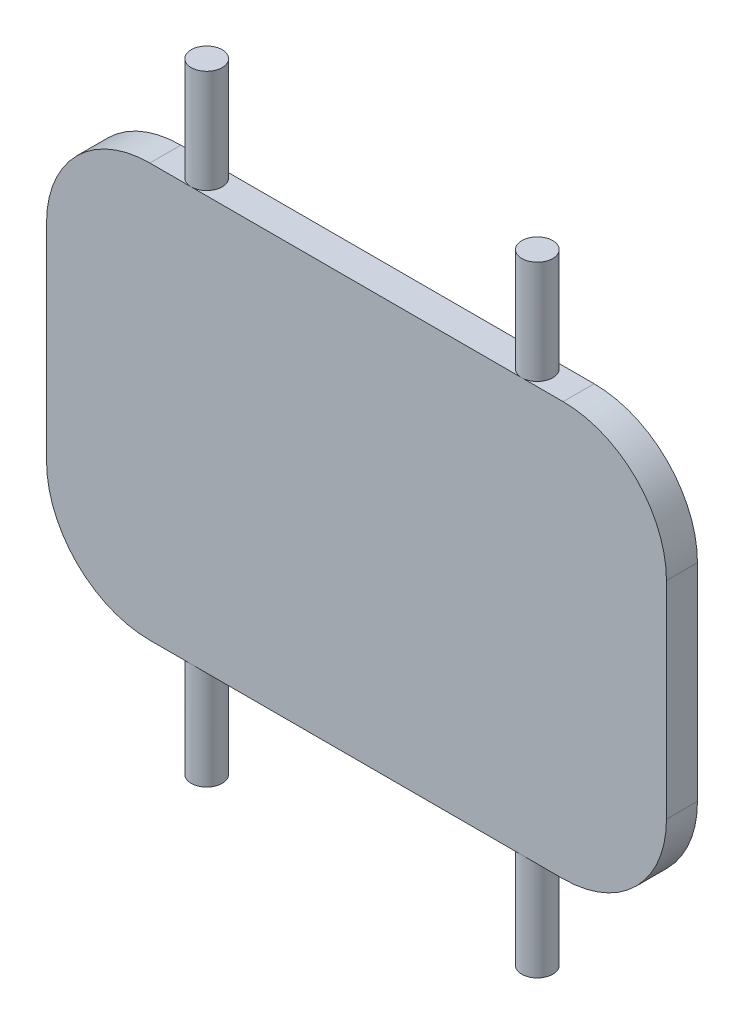
ISO-10303-21;
HEADER;
FILE_DESCRIPTION(('STEP AP214'),'2;1');
FILE_NAME('part.step','',(''),(''),'','','');
FILE_SCHEMA(('AUTOMOTIVE_DESIGN { 1 0 10303 214 1 1 1 1 }'));
ENDSEC;
DATA;
#1=APPLICATION_CONTEXT('core data for automotive mechanical design processes');
#2=APPLICATION_PROTOCOL_DEFINITION('international standard','automotive_design',2000,#1);
#3=PRODUCT_CONTEXT('',#1,'mechanical');
#4=PRODUCT('Part','Part','',(#3));
#5=PRODUCT_RELATED_PRODUCT_CATEGORY('part','',(#4));
#6=PRODUCT_DEFINITION_FORMATION('','',#4);
#7=PRODUCT_DEFINITION_CONTEXT('part definition',#1,'design');
#8=PRODUCT_DEFINITION('design','',#6,#7);
#9=PRODUCT_DEFINITION_SHAPE('','',#8);
#10=(LENGTH_UNIT() NAMED_UNIT(*) SI_UNIT(.MILLI.,.METRE.));
#11=(NAMED_UNIT(*) PLANE_ANGLE_UNIT() SI_UNIT($,.RADIAN.));
#12=(NAMED_UNIT(*) SI_UNIT($,.STERADIAN.) SOLID_ANGLE_UNIT());
#13=UNCERTAINTY_MEASURE_WITH_UNIT(LENGTH_MEASURE(1.E-05),#10,'distance_accuracy_value','');
#14=(GEOMETRIC_REPRESENTATION_CONTEXT(3) GLOBAL_UNCERTAINTY_ASSIGNED_CONTEXT((#13)) GLOBAL_UNIT_ASSIGNED_CONTEXT((#10,
#11,#12)) REPRESENTATION_CONTEXT('',''));
#15=CARTESIAN_POINT('',(0.,0.,0.));
#16=DIRECTION('',(0.,0.,1.));
#17=DIRECTION('',(1.,0.,0.));
#18=AXIS2_PLACEMENT_3D('',#15,#16,#17);
#19=CARTESIAN_POINT('',(-150.,100.,15.));
#20=DIRECTION('',(0.,-1.,0.));
#21=DIRECTION('',(0.,0.,-1.));
#22=AXIS2_PLACEMENT_3D('',#19,#20,#21);
#23=PLANE('',#22);
#24=DIRECTION('',(-1.,0.,0.));
#25=VECTOR('',#24,1.);
#26=CARTESIAN_POINT('',(-150.,100.,0.));
#27=LINE('',#26,#25);
#28=CARTESIAN_POINT('',(100.,100.,0.));
#29=VERTEX_POINT('',#28);
#30=CARTESIAN_POINT('',(80.,100.,0.));
#31=VERTEX_POINT('',#30);
#32=EDGE_CURVE('E140',#29,#31,#27,.T.);
#33=ORIENTED_EDGE('',*,*,#32,.T.);
#34=CARTESIAN_POINT('',(80.,100.,7.5));
#35=DIRECTION('',(0.,-1.,0.));
#36=DIRECTION('',(0.,0.,-1.));
#37=AXIS2_PLACEMENT_3D('',#34,#35,#36);
#38=CIRCLE('',#37,7.5);
#39=CARTESIAN_POINT('',(80.,100.,15.));
#40=VERTEX_POINT('',#39);
#41=EDGE_CURVE('E54',#31,#40,#38,.T.);
#42=ORIENTED_EDGE('',*,*,#41,.T.);
#43=DIRECTION('',(-1.,0.,0.));
#44=VECTOR('',#43,1.);
#45=CARTESIAN_POINT('',(-150.,100.,15.));
#46=LINE('',#45,#44);
#47=CARTESIAN_POINT('',(100.,100.,15.));
#48=VERTEX_POINT('',#47);
#49=EDGE_CURVE('E137',#48,#40,#46,.T.);
#50=ORIENTED_EDGE('',*,*,#49,.F.);
#51=DIRECTION('',(0.,0.,-1.));
#52=VECTOR('',#51,1.);
#53=CARTESIAN_POINT('',(100.,100.,15.));
#54=LINE('',#53,#52);
#55=EDGE_CURVE('E219',#48,#29,#54,.T.);
#56=ORIENTED_EDGE('',*,*,#55,.T.);
#57=EDGE_LOOP('',(#33,#42,#50,#56));
#58=FACE_BOUND('',#57,.T.);
#59=ADVANCED_FACE('F39',(#58),#23,.F.);
#60=CARTESIAN_POINT('',(-80.,100.,7.5));
#61=DIRECTION('',(0.,1.,0.));
#62=DIRECTION('',(0.,0.,-1.));
#63=AXIS2_PLACEMENT_3D('',#60,#61,#62);
#64=CIRCLE('',#63,7.5);
#65=CARTESIAN_POINT('',(-80.,100.,0.));
#66=VERTEX_POINT('',#65);
#67=CARTESIAN_POINT('',(-80.,100.,15.));
#68=VERTEX_POINT('',#67);
#69=EDGE_CURVE('E192',#66,#68,#64,.T.);
#70=ORIENTED_EDGE('',*,*,#69,.F.);
#71=CARTESIAN_POINT('',(-100.,100.,0.));
#72=VERTEX_POINT('',#71);
#73=EDGE_CURVE('E211',#66,#72,#27,.T.);
#74=ORIENTED_EDGE('',*,*,#73,.T.);
#75=DIRECTION('',(0.,0.,-1.));
#76=VECTOR('',#75,1.);
#77=CARTESIAN_POINT('',(-100.,100.,15.));
#78=LINE('',#77,#76);
#79=CARTESIAN_POINT('',(-100.,100.,15.));
#80=VERTEX_POINT('',#79);
#81=EDGE_CURVE('E214',#72,#80,#78,.F.);
#82=ORIENTED_EDGE('',*,*,#81,.T.);
#83=EDGE_CURVE('E148',#68,#80,#46,.T.);
#84=ORIENTED_EDGE('',*,*,#83,.F.);
#85=EDGE_LOOP('',(#70,#74,#82,#84));
#86=FACE_BOUND('',#85,.T.);
#87=ADVANCED_FACE('F209',(#86),#23,.F.);
#88=CARTESIAN_POINT('',(-150.,-100.,15.));
#89=DIRECTION('',(0.,1.,0.));
#90=DIRECTION('',(0.,0.,1.));
#91=AXIS2_PLACEMENT_3D('',#88,#89,#90);
#92=PLANE('',#91);
#93=DIRECTION('',(1.,0.,0.));
#94=VECTOR('',#93,1.);
#95=CARTESIAN_POINT('',(-150.,-100.,15.));
#96=LINE('',#95,#94);
#97=CARTESIAN_POINT('',(-80.,-100.,15.));
#98=VERTEX_POINT('',#97);
#99=CARTESIAN_POINT('',(80.,-100.,15.));
#100=VERTEX_POINT('',#99);
#101=EDGE_CURVE('E504',#98,#100,#96,.T.);
#102=ORIENTED_EDGE('',*,*,#101,.F.);
#103=CARTESIAN_POINT('',(-80.,-100.,7.5));
#104=DIRECTION('',(0.,1.,0.));
#105=DIRECTION('',(0.,0.,-1.));
#106=AXIS2_PLACEMENT_3D('',#103,#104,#105);
#107=CIRCLE('',#106,7.5);
#108=CARTESIAN_POINT('',(-80.,-100.,0.));
#109=VERTEX_POINT('',#108);
#110=EDGE_CURVE('E188',#98,#109,#107,.T.);
#111=ORIENTED_EDGE('',*,*,#110,.T.);
#112=DIRECTION('',(1.,0.,0.));
#113=VECTOR('',#112,1.);
#114=CARTESIAN_POINT('',(-150.,-100.,0.));
#115=LINE('',#114,#113);
#116=CARTESIAN_POINT('',(80.,-100.,0.));
#117=VERTEX_POINT('',#116);
#118=EDGE_CURVE('E169',#109,#117,#115,.T.);
#119=ORIENTED_EDGE('',*,*,#118,.T.);
#120=CARTESIAN_POINT('',(80.,-100.,7.5));
#121=DIRECTION('',(0.,-1.,0.));
#122=DIRECTION('',(0.,0.,-1.));
#123=AXIS2_PLACEMENT_3D('',#120,#121,#122);
#124=CIRCLE('',#123,7.5);
#125=EDGE_CURVE('E178',#100,#117,#124,.T.);
#126=ORIENTED_EDGE('',*,*,#125,.F.);
#127=EDGE_LOOP('',(#102,#111,#119,#126));
#128=FACE_BOUND('',#127,.T.);
#129=ADVANCED_FACE('F327',(#128),#92,.F.);
#130=CARTESIAN_POINT('',(-100.,-100.,0.));
#131=VERTEX_POINT('',#130);
#132=EDGE_CURVE('E165',#131,#109,#115,.T.);
#133=ORIENTED_EDGE('',*,*,#132,.T.);
#134=EDGE_CURVE('E183',#109,#98,#107,.T.);
#135=ORIENTED_EDGE('',*,*,#134,.T.);
#136=CARTESIAN_POINT('',(-100.,-100.,15.));
#137=VERTEX_POINT('',#136);
#138=EDGE_CURVE('E248',#137,#98,#96,.T.);
#139=ORIENTED_EDGE('',*,*,#138,.F.);
#140=DIRECTION('',(0.,0.,-1.));
#141=VECTOR('',#140,1.);
#142=CARTESIAN_POINT('',(-100.,-100.,15.));
#143=LINE('',#142,#141);
#144=EDGE_CURVE('E48',#137,#131,#143,.T.);
#145=ORIENTED_EDGE('',*,*,#144,.T.);
#146=EDGE_LOOP('',(#133,#135,#139,#145));
#147=FACE_BOUND('',#146,.T.);
#148=ADVANCED_FACE('F246',(#147),#92,.F.);
#149=CARTESIAN_POINT('',(150.,100.,15.));
#150=DIRECTION('',(-1.,0.,0.));
#151=DIRECTION('',(0.,0.,1.));
#152=AXIS2_PLACEMENT_3D('',#149,#150,#151);
#153=PLANE('',#152);
#154=DIRECTION('',(0.,1.,0.));
#155=VECTOR('',#154,1.);
#156=CARTESIAN_POINT('',(150.,100.,0.));
#157=LINE('',#156,#155);
#158=CARTESIAN_POINT('',(150.,-50.,0.));
#159=VERTEX_POINT('',#158);
#160=CARTESIAN_POINT('',(150.,50.,0.));
#161=VERTEX_POINT('',#160);
#162=EDGE_CURVE('E182',#159,#161,#157,.T.);
#163=ORIENTED_EDGE('',*,*,#162,.T.);
#164=DIRECTION('',(0.,0.,-1.));
#165=VECTOR('',#164,1.);
#166=CARTESIAN_POINT('',(150.,50.,15.));
#167=LINE('',#166,#165);
#168=CARTESIAN_POINT('',(150.,50.,15.));
#169=VERTEX_POINT('',#168);
#170=EDGE_CURVE('E233',#161,#169,#167,.F.);
#171=ORIENTED_EDGE('',*,*,#170,.T.);
#172=DIRECTION('',(0.,1.,0.));
#173=VECTOR('',#172,1.);
#174=CARTESIAN_POINT('',(150.,100.,15.));
#175=LINE('',#174,#173);
#176=CARTESIAN_POINT('',(150.,-50.,15.));
#177=VERTEX_POINT('',#176);
#178=EDGE_CURVE('E162',#177,#169,#175,.T.);
#179=ORIENTED_EDGE('',*,*,#178,.F.);
#180=DIRECTION('',(0.,0.,-1.));
#181=VECTOR('',#180,1.);
#182=CARTESIAN_POINT('',(150.,-50.,15.));
#183=LINE('',#182,#181);
#184=EDGE_CURVE('E228',#177,#159,#183,.T.);
#185=ORIENTED_EDGE('',*,*,#184,.T.);
#186=EDGE_LOOP('',(#163,#171,#179,#185));
#187=FACE_BOUND('',#186,.T.);
#188=ADVANCED_FACE('F297',(#187),#153,.F.);
#189=EDGE_CURVE('E62',#40,#68,#46,.T.);
#190=ORIENTED_EDGE('',*,*,#189,.F.);
#191=EDGE_CURVE('E127',#40,#31,#38,.T.);
#192=ORIENTED_EDGE('',*,*,#191,.T.);
#193=EDGE_CURVE('E304',#31,#66,#27,.T.);
#194=ORIENTED_EDGE('',*,*,#193,.T.);
#195=EDGE_CURVE('E145',#68,#66,#64,.T.);
#196=ORIENTED_EDGE('',*,*,#195,.F.);
#197=EDGE_LOOP('',(#190,#192,#194,#196));
#198=FACE_BOUND('',#197,.T.);
#199=ADVANCED_FACE('F143',(#198),#23,.F.);
#200=CARTESIAN_POINT('',(-150.,100.,15.));
#201=DIRECTION('',(1.,0.,0.));
#202=DIRECTION('',(0.,1.,0.));
#203=AXIS2_PLACEMENT_3D('',#200,#201,#202);
#204=PLANE('',#203);
#205=DIRECTION('',(0.,-1.,0.));
#206=VECTOR('',#205,1.);
#207=CARTESIAN_POINT('',(-150.,100.,15.));
#208=LINE('',#207,#206);
#209=CARTESIAN_POINT('',(-150.,50.,15.));
#210=VERTEX_POINT('',#209);
#211=CARTESIAN_POINT('',(-150.,-50.,15.));
#212=VERTEX_POINT('',#211);
#213=EDGE_CURVE('E155',#210,#212,#208,.T.);
#214=ORIENTED_EDGE('',*,*,#213,.F.);
#215=DIRECTION('',(0.,0.,-1.));
#216=VECTOR('',#215,1.);
#217=CARTESIAN_POINT('',(-150.,50.,15.));
#218=LINE('',#217,#216);
#219=CARTESIAN_POINT('',(-150.,50.,0.));
#220=VERTEX_POINT('',#219);
#221=EDGE_CURVE('E225',#210,#220,#218,.T.);
#222=ORIENTED_EDGE('',*,*,#221,.T.);
#223=DIRECTION('',(0.,-1.,0.));
#224=VECTOR('',#223,1.);
#225=CARTESIAN_POINT('',(-150.,100.,0.));
#226=LINE('',#225,#224);
#227=CARTESIAN_POINT('',(-150.,-50.,0.));
#228=VERTEX_POINT('',#227);
#229=EDGE_CURVE('E266',#220,#228,#226,.T.);
#230=ORIENTED_EDGE('',*,*,#229,.T.);
#231=DIRECTION('',(0.,0.,-1.));
#232=VECTOR('',#231,1.);
#233=CARTESIAN_POINT('',(-150.,-50.,15.));
#234=LINE('',#233,#232);
#235=EDGE_CURVE('E270',#228,#212,#234,.F.);
#236=ORIENTED_EDGE('',*,*,#235,.T.);
#237=EDGE_LOOP('',(#214,#222,#230,#236));
#238=FACE_BOUND('',#237,.T.);
#239=ADVANCED_FACE('F310',(#238),#204,.F.);
#240=EDGE_CURVE('E173',#117,#100,#124,.T.);
#241=ORIENTED_EDGE('',*,*,#240,.F.);
#242=CARTESIAN_POINT('',(100.,-100.,0.));
#243=VERTEX_POINT('',#242);
#244=EDGE_CURVE('E171',#117,#243,#115,.T.);
#245=ORIENTED_EDGE('',*,*,#244,.T.);
#246=DIRECTION('',(0.,0.,-1.));
#247=VECTOR('',#246,1.);
#248=CARTESIAN_POINT('',(100.,-100.,15.));
#249=LINE('',#248,#247);
#250=CARTESIAN_POINT('',(100.,-100.,15.));
#251=VERTEX_POINT('',#250);
#252=EDGE_CURVE('E11',#243,#251,#249,.F.);
#253=ORIENTED_EDGE('',*,*,#252,.T.);
#254=EDGE_CURVE('E158',#100,#251,#96,.T.);
#255=ORIENTED_EDGE('',*,*,#254,.F.);
#256=EDGE_LOOP('',(#241,#245,#253,#255));
#257=FACE_BOUND('',#256,.T.);
#258=ADVANCED_FACE('F335',(#257),#92,.F.);
#259=CARTESIAN_POINT('',(0.,0.,15.));
#260=DIRECTION('',(0.,0.,1.));
#261=DIRECTION('',(1.,0.,0.));
#262=AXIS2_PLACEMENT_3D('',#259,#260,#261);
#263=PLANE('',#262);
#264=ORIENTED_EDGE('',*,*,#49,.T.);
#265=ORIENTED_EDGE('',*,*,#189,.T.);
#266=ORIENTED_EDGE('',*,*,#83,.T.);
#267=CARTESIAN_POINT('',(-100.,50.,15.));
#268=DIRECTION('',(0.,0.,1.));
#269=DIRECTION('',(1.,0.,0.));
#270=AXIS2_PLACEMENT_3D('',#267,#268,#269);
#271=CIRCLE('',#270,50.);
#272=EDGE_CURVE('E222',#80,#210,#271,.T.);
#273=ORIENTED_EDGE('',*,*,#272,.T.);
#274=ORIENTED_EDGE('',*,*,#213,.T.);
#275=CARTESIAN_POINT('',(-100.,-50.,15.));
#276=DIRECTION('',(0.,0.,1.));
#277=DIRECTION('',(1.,0.,0.));
#278=AXIS2_PLACEMENT_3D('',#275,#276,#277);
#279=CIRCLE('',#278,50.);
#280=EDGE_CURVE('E218',#212,#137,#279,.T.);
#281=ORIENTED_EDGE('',*,*,#280,.T.);
#282=ORIENTED_EDGE('',*,*,#138,.T.);
#283=ORIENTED_EDGE('',*,*,#101,.T.);
#284=ORIENTED_EDGE('',*,*,#254,.T.);
#285=CARTESIAN_POINT('',(100.,-50.,15.));
#286=DIRECTION('',(0.,0.,1.));
#287=DIRECTION('',(1.,0.,0.));
#288=AXIS2_PLACEMENT_3D('',#285,#286,#287);
#289=CIRCLE('',#288,50.);
#290=EDGE_CURVE('E235',#251,#177,#289,.T.);
#291=ORIENTED_EDGE('',*,*,#290,.T.);
#292=ORIENTED_EDGE('',*,*,#178,.T.);
#293=CARTESIAN_POINT('',(100.,50.,15.));
#294=DIRECTION('',(0.,0.,1.));
#295=DIRECTION('',(1.,0.,0.));
#296=AXIS2_PLACEMENT_3D('',#293,#294,#295);
#297=CIRCLE('',#296,50.);
#298=EDGE_CURVE('E153',#169,#48,#297,.T.);
#299=ORIENTED_EDGE('',*,*,#298,.T.);
#300=EDGE_LOOP('',(#264,#265,#266,#273,#274,#281,#282,#283,#284,#291,#292,#299));
#301=FACE_BOUND('',#300,.T.);
#302=ADVANCED_FACE('F150',(#301),#263,.T.);
#303=CARTESIAN_POINT('',(0.,0.,0.));
#304=DIRECTION('',(0.,0.,1.));
#305=DIRECTION('',(1.,0.,0.));
#306=AXIS2_PLACEMENT_3D('',#303,#304,#305);
#307=PLANE('',#306);
#308=ORIENTED_EDGE('',*,*,#229,.F.);
#309=CARTESIAN_POINT('',(-100.,50.,0.));
#310=DIRECTION('',(0.,0.,1.));
#311=DIRECTION('',(1.,0.,0.));
#312=AXIS2_PLACEMENT_3D('',#309,#310,#311);
#313=CIRCLE('',#312,50.);
#314=EDGE_CURVE('E283',#220,#72,#313,.F.);
#315=ORIENTED_EDGE('',*,*,#314,.T.);
#316=ORIENTED_EDGE('',*,*,#73,.F.);
#317=ORIENTED_EDGE('',*,*,#193,.F.);
#318=ORIENTED_EDGE('',*,*,#32,.F.);
#319=CARTESIAN_POINT('',(100.,50.,0.));
#320=DIRECTION('',(0.,0.,1.));
#321=DIRECTION('',(1.,0.,0.));
#322=AXIS2_PLACEMENT_3D('',#319,#320,#321);
#323=CIRCLE('',#322,50.);
#324=EDGE_CURVE('E280',#29,#161,#323,.F.);
#325=ORIENTED_EDGE('',*,*,#324,.T.);
#326=ORIENTED_EDGE('',*,*,#162,.F.);
#327=CARTESIAN_POINT('',(100.,-50.,0.));
#328=DIRECTION('',(0.,0.,1.));
#329=DIRECTION('',(1.,0.,0.));
#330=AXIS2_PLACEMENT_3D('',#327,#328,#329);
#331=CIRCLE('',#330,50.);
#332=EDGE_CURVE('E277',#159,#243,#331,.F.);
#333=ORIENTED_EDGE('',*,*,#332,.T.);
#334=ORIENTED_EDGE('',*,*,#244,.F.);
#335=ORIENTED_EDGE('',*,*,#118,.F.);
#336=ORIENTED_EDGE('',*,*,#132,.F.);
#337=CARTESIAN_POINT('',(-100.,-50.,0.));
#338=DIRECTION('',(0.,0.,1.));
#339=DIRECTION('',(1.,0.,0.));
#340=AXIS2_PLACEMENT_3D('',#337,#338,#339);
#341=CIRCLE('',#340,50.);
#342=EDGE_CURVE('E255',#131,#228,#341,.F.);
#343=ORIENTED_EDGE('',*,*,#342,.T.);
#344=EDGE_LOOP('',(#308,#315,#316,#317,#318,#325,#326,#333,#334,#335,#336,#343));
#345=FACE_BOUND('',#344,.T.);
#346=ADVANCED_FACE('F254',(#345),#307,.F.);
#347=CARTESIAN_POINT('',(-100.,50.,15.));
#348=DIRECTION('',(0.,0.,-1.));
#349=DIRECTION('',(-1.,0.,0.));
#350=AXIS2_PLACEMENT_3D('',#347,#348,#349);
#351=CYLINDRICAL_SURFACE('',#350,50.);
#352=ORIENTED_EDGE('',*,*,#272,.F.);
#353=ORIENTED_EDGE('',*,*,#81,.F.);
#354=ORIENTED_EDGE('',*,*,#314,.F.);
#355=ORIENTED_EDGE('',*,*,#221,.F.);
#356=EDGE_LOOP('',(#352,#353,#354,#355));
#357=FACE_BOUND('',#356,.T.);
#358=ADVANCED_FACE('F223',(#357),#351,.T.);
#359=CARTESIAN_POINT('',(100.,50.,15.));
#360=DIRECTION('',(0.,0.,-1.));
#361=DIRECTION('',(-1.,0.,0.));
#362=AXIS2_PLACEMENT_3D('',#359,#360,#361);
#363=CYLINDRICAL_SURFACE('',#362,50.);
#364=ORIENTED_EDGE('',*,*,#298,.F.);
#365=ORIENTED_EDGE('',*,*,#170,.F.);
#366=ORIENTED_EDGE('',*,*,#324,.F.);
#367=ORIENTED_EDGE('',*,*,#55,.F.);
#368=EDGE_LOOP('',(#364,#365,#366,#367));
#369=FACE_BOUND('',#368,.T.);
#370=ADVANCED_FACE('F321',(#369),#363,.T.);
#371=CARTESIAN_POINT('',(100.,-50.,15.));
#372=DIRECTION('',(0.,0.,-1.));
#373=DIRECTION('',(-1.,0.,0.));
#374=AXIS2_PLACEMENT_3D('',#371,#372,#373);
#375=CYLINDRICAL_SURFACE('',#374,50.);
#376=ORIENTED_EDGE('',*,*,#290,.F.);
#377=ORIENTED_EDGE('',*,*,#252,.F.);
#378=ORIENTED_EDGE('',*,*,#332,.F.);
#379=ORIENTED_EDGE('',*,*,#184,.F.);
#380=EDGE_LOOP('',(#376,#377,#378,#379));
#381=FACE_BOUND('',#380,.T.);
#382=ADVANCED_FACE('F300',(#381),#375,.T.);
#383=CARTESIAN_POINT('',(-100.,-50.,15.));
#384=DIRECTION('',(0.,0.,-1.));
#385=DIRECTION('',(-1.,0.,0.));
#386=AXIS2_PLACEMENT_3D('',#383,#384,#385);
#387=CYLINDRICAL_SURFACE('',#386,50.);
#388=ORIENTED_EDGE('',*,*,#280,.F.);
#389=ORIENTED_EDGE('',*,*,#235,.F.);
#390=ORIENTED_EDGE('',*,*,#342,.F.);
#391=ORIENTED_EDGE('',*,*,#144,.F.);
#392=EDGE_LOOP('',(#388,#389,#390,#391));
#393=FACE_BOUND('',#392,.T.);
#394=ADVANCED_FACE('F41',(#393),#387,.T.);
#395=CARTESIAN_POINT('',(80.,-150.,7.5));
#396=DIRECTION('',(0.,1.,0.));
#397=DIRECTION('',(0.,0.,1.));
#398=AXIS2_PLACEMENT_3D('',#395,#396,#397);
#399=CYLINDRICAL_SURFACE('',#398,7.5);
#400=CARTESIAN_POINT('',(80.,-150.,7.5));
#401=DIRECTION('',(0.,-1.,0.));
#402=DIRECTION('',(0.,0.,-1.));
#403=AXIS2_PLACEMENT_3D('',#400,#401,#402);
#404=CIRCLE('',#403,7.5);
#405=CARTESIAN_POINT('',(80.,-150.,0.));
#406=VERTEX_POINT('',#405);
#407=EDGE_CURVE('E177',#406,#406,#404,.T.);
#408=ORIENTED_EDGE('',*,*,#407,.F.);
#409=EDGE_LOOP('',(#408));
#410=FACE_BOUND('',#409,.T.);
#411=ORIENTED_EDGE('',*,*,#240,.T.);
#412=ORIENTED_EDGE('',*,*,#125,.T.);
#413=EDGE_LOOP('',(#411,#412));
#414=FACE_BOUND('',#413,.T.);
#415=ADVANCED_FACE('F313',(#410,#414),#399,.T.);
#416=CARTESIAN_POINT('',(80.,-150.,7.5));
#417=DIRECTION('',(0.,-1.,0.));
#418=DIRECTION('',(0.,0.,-1.));
#419=AXIS2_PLACEMENT_3D('',#416,#417,#418);
#420=PLANE('',#419);
#421=ORIENTED_EDGE('',*,*,#407,.T.);
#422=EDGE_LOOP('',(#421));
#423=FACE_BOUND('',#422,.T.);
#424=ADVANCED_FACE('F318',(#423),#420,.T.);
#425=CARTESIAN_POINT('',(-80.,-150.,7.5));
#426=DIRECTION('',(0.,1.,0.));
#427=DIRECTION('',(0.,0.,1.));
#428=AXIS2_PLACEMENT_3D('',#425,#426,#427);
#429=CYLINDRICAL_SURFACE('',#428,7.5);
#430=CARTESIAN_POINT('',(-80.,-150.,7.5));
#431=DIRECTION('',(0.,1.,0.));
#432=DIRECTION('',(0.,0.,-1.));
#433=AXIS2_PLACEMENT_3D('',#430,#431,#432);
#434=CIRCLE('',#433,7.5);
#435=CARTESIAN_POINT('',(-80.,-150.,0.));
#436=VERTEX_POINT('',#435);
#437=EDGE_CURVE('E187',#436,#436,#434,.T.);
#438=ORIENTED_EDGE('',*,*,#437,.T.);
#439=EDGE_LOOP('',(#438));
#440=FACE_BOUND('',#439,.T.);
#441=ORIENTED_EDGE('',*,*,#134,.F.);
#442=ORIENTED_EDGE('',*,*,#110,.F.);
#443=EDGE_LOOP('',(#441,#442));
#444=FACE_BOUND('',#443,.T.);
#445=ADVANCED_FACE('F385',(#440,#444),#429,.T.);
#446=CARTESIAN_POINT('',(-80.,-150.,7.5));
#447=DIRECTION('',(0.,-1.,0.));
#448=DIRECTION('',(0.,0.,-1.));
#449=AXIS2_PLACEMENT_3D('',#446,#447,#448);
#450=PLANE('',#449);
#451=ORIENTED_EDGE('',*,*,#437,.F.);
#452=EDGE_LOOP('',(#451));
#453=FACE_BOUND('',#452,.T.);
#454=ADVANCED_FACE('F407',(#453),#450,.T.);
#455=CARTESIAN_POINT('',(-80.,150.,7.5));
#456=DIRECTION('',(0.,-1.,0.));
#457=DIRECTION('',(0.,0.,-1.));
#458=AXIS2_PLACEMENT_3D('',#455,#456,#457);
#459=CYLINDRICAL_SURFACE('',#458,7.5);
#460=CARTESIAN_POINT('',(-80.,150.,7.5));
#461=DIRECTION('',(0.,1.,0.));
#462=DIRECTION('',(0.,0.,-1.));
#463=AXIS2_PLACEMENT_3D('',#460,#461,#462);
#464=CIRCLE('',#463,7.5);
#465=CARTESIAN_POINT('',(-80.,150.,0.));
#466=VERTEX_POINT('',#465);
#467=EDGE_CURVE('E196',#466,#466,#464,.T.);
#468=ORIENTED_EDGE('',*,*,#467,.F.);
#469=EDGE_LOOP('',(#468));
#470=FACE_BOUND('',#469,.T.);
#471=ORIENTED_EDGE('',*,*,#69,.T.);
#472=ORIENTED_EDGE('',*,*,#195,.T.);
#473=EDGE_LOOP('',(#471,#472));
#474=FACE_BOUND('',#473,.T.);
#475=ADVANCED_FACE('F206',(#470,#474),#459,.T.);
#476=CARTESIAN_POINT('',(-80.,150.,7.5));
#477=DIRECTION('',(0.,1.,0.));
#478=DIRECTION('',(0.,0.,-1.));
#479=AXIS2_PLACEMENT_3D('',#476,#477,#478);
#480=PLANE('',#479);
#481=ORIENTED_EDGE('',*,*,#467,.T.);
#482=EDGE_LOOP('',(#481));
#483=FACE_BOUND('',#482,.T.);
#484=ADVANCED_FACE('F455',(#483),#480,.T.);
#485=CARTESIAN_POINT('',(80.,150.,7.5));
#486=DIRECTION('',(0.,-1.,0.));
#487=DIRECTION('',(0.,0.,-1.));
#488=AXIS2_PLACEMENT_3D('',#485,#486,#487);
#489=CYLINDRICAL_SURFACE('',#488,7.5);
#490=CARTESIAN_POINT('',(80.,150.,7.5));
#491=DIRECTION('',(0.,-1.,0.));
#492=DIRECTION('',(0.,0.,-1.));
#493=AXIS2_PLACEMENT_3D('',#490,#491,#492);
#494=CIRCLE('',#493,7.5);
#495=CARTESIAN_POINT('',(80.,150.,0.));
#496=VERTEX_POINT('',#495);
#497=EDGE_CURVE('E142',#496,#496,#494,.T.);
#498=ORIENTED_EDGE('',*,*,#497,.T.);
#499=EDGE_LOOP('',(#498));
#500=FACE_BOUND('',#499,.T.);
#501=ORIENTED_EDGE('',*,*,#41,.F.);
#502=ORIENTED_EDGE('',*,*,#191,.F.);
#503=EDGE_LOOP('',(#501,#502));
#504=FACE_BOUND('',#503,.T.);
#505=ADVANCED_FACE('F128',(#500,#504),#489,.T.);
#506=CARTESIAN_POINT('',(80.,150.,7.5));
#507=DIRECTION('',(0.,1.,0.));
#508=DIRECTION('',(0.,0.,-1.));
#509=AXIS2_PLACEMENT_3D('',#506,#507,#508);
#510=PLANE('',#509);
#511=ORIENTED_EDGE('',*,*,#497,.F.);
#512=EDGE_LOOP('',(#511));
#513=FACE_BOUND('',#512,.T.);
#514=ADVANCED_FACE('F474',(#513),#510,.T.);
#515=CLOSED_SHELL('',(#59,#87,#129,#148,#188,#199,#239,#258,#302,#346,#358,#370,#382,#394,#415,
#424,#445,#454,#475,#484,#505,#514));
#516=MANIFOLD_SOLID_BREP('B2',#515);
#517=ADVANCED_BREP_SHAPE_REPRESENTATION('',(#18,#516),#14);
#518=SHAPE_DEFINITION_REPRESENTATION(#9,#517);
ENDSEC;
END-ISO-10303-21;
